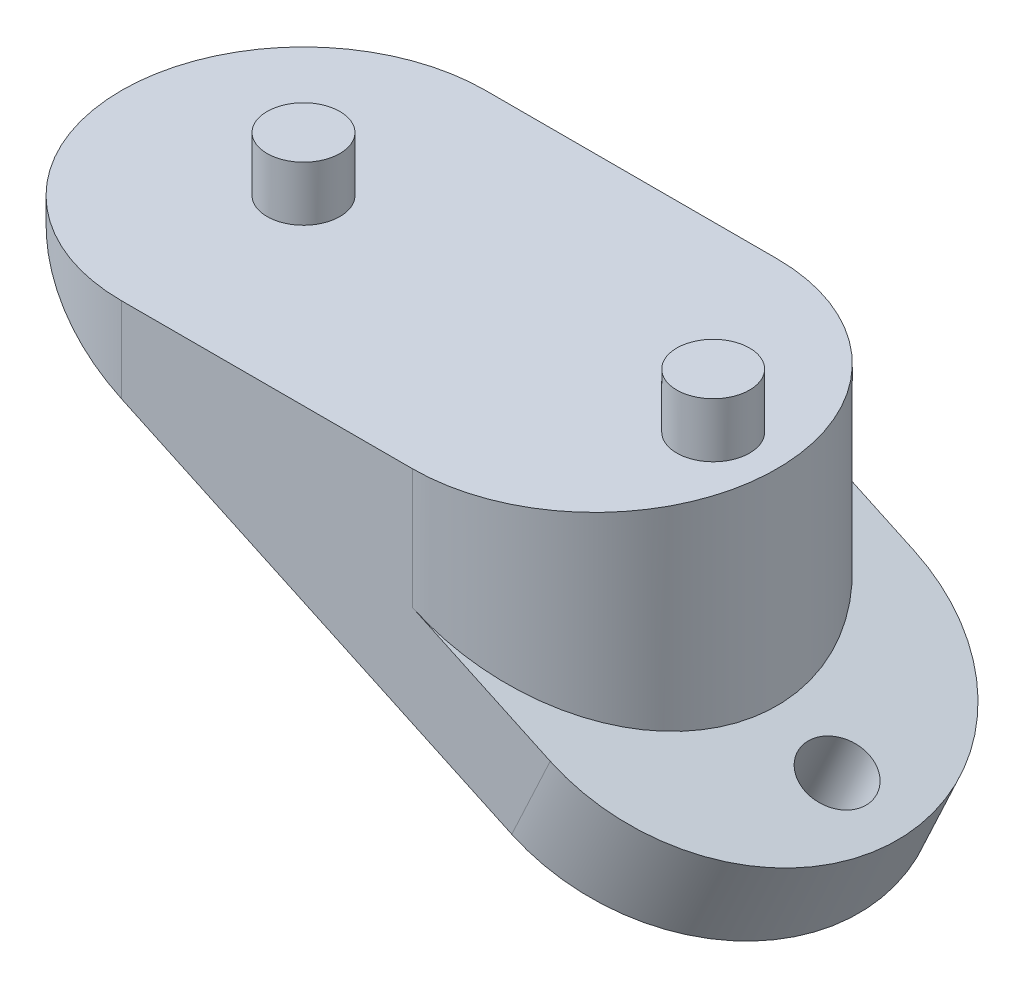
ISO-10303-21;
HEADER;
FILE_DESCRIPTION(('STEP AP214'),'2;1');
FILE_NAME('part.step','',(''),(''),'','','');
FILE_SCHEMA(('AUTOMOTIVE_DESIGN { 1 0 10303 214 1 1 1 1 }'));
ENDSEC;
DATA;
#1=APPLICATION_CONTEXT('core data for automotive mechanical design processes');
#2=APPLICATION_PROTOCOL_DEFINITION('international standard','automotive_design',2000,#1);
#3=PRODUCT_CONTEXT('',#1,'mechanical');
#4=PRODUCT('Part','Part','',(#3));
#5=PRODUCT_RELATED_PRODUCT_CATEGORY('part','',(#4));
#6=PRODUCT_DEFINITION_FORMATION('','',#4);
#7=PRODUCT_DEFINITION_CONTEXT('part definition',#1,'design');
#8=PRODUCT_DEFINITION('design','',#6,#7);
#9=PRODUCT_DEFINITION_SHAPE('','',#8);
#10=(LENGTH_UNIT() NAMED_UNIT(*) SI_UNIT(.MILLI.,.METRE.));
#11=(NAMED_UNIT(*) PLANE_ANGLE_UNIT() SI_UNIT($,.RADIAN.));
#12=(NAMED_UNIT(*) SI_UNIT($,.STERADIAN.) SOLID_ANGLE_UNIT());
#13=UNCERTAINTY_MEASURE_WITH_UNIT(LENGTH_MEASURE(1.E-05),#10,'distance_accuracy_value','');
#14=(GEOMETRIC_REPRESENTATION_CONTEXT(3) GLOBAL_UNCERTAINTY_ASSIGNED_CONTEXT((#13)) GLOBAL_UNIT_ASSIGNED_CONTEXT((#10,
#11,#12)) REPRESENTATION_CONTEXT('',''));
#15=CARTESIAN_POINT('',(0.,0.,0.));
#16=DIRECTION('',(0.,0.,1.));
#17=DIRECTION('',(1.,0.,0.));
#18=AXIS2_PLACEMENT_3D('',#15,#16,#17);
#19=CARTESIAN_POINT('',(-0.387635692740401,7.09992703370681,22.5504836688192));
#20=DIRECTION('',(0.422618261740697,0.906307787036651,0.));
#21=DIRECTION('',(-0.906307787036651,0.422618261740697,0.));
#22=AXIS2_PLACEMENT_3D('',#19,#20,#21);
#23=PLANE('',#22);
#24=CARTESIAN_POINT('',(37.956552029906,-10.7802613470959,12.5504836688192));
#25=DIRECTION('',(0.422618261740697,0.906307787036651,0.));
#26=DIRECTION('',(-0.906307787036651,0.422618261740697,0.));
#27=AXIS2_PLACEMENT_3D('',#24,#25,#26);
#28=CIRCLE('',#27,1.75);
#29=CARTESIAN_POINT('',(36.3705134025918,-10.0406793890497,12.5504836688192));
#30=VERTEX_POINT('',#29);
#31=EDGE_CURVE('E153',#30,#30,#28,.T.);
#32=ORIENTED_EDGE('',*,*,#31,.F.);
#33=EDGE_LOOP('',(#32));
#34=FACE_BOUND('',#33,.T.);
#35=DIRECTION('',(0.906307787036651,-0.422618261740697,0.));
#36=VECTOR('',#35,1.);
#37=CARTESIAN_POINT('',(-0.387635692740387,7.0999270337068,2.55048366881918));
#38=LINE('',#37,#36);
#39=CARTESIAN_POINT('',(24.649544079261,-4.57510163258079,2.55048366881919));
#40=VERTEX_POINT('',#39);
#41=CARTESIAN_POINT('',(32.2004821101844,-8.09616186265418,2.5504836688192));
#42=VERTEX_POINT('',#41);
#43=EDGE_CURVE('E65',#40,#42,#38,.T.);
#44=ORIENTED_EDGE('',*,*,#43,.F.);
#45=CARTESIAN_POINT('',(24.649544079261,-4.5751016325808,12.5504836688192));
#46=DIRECTION('',(0.422618261740697,0.906307787036651,0.));
#47=DIRECTION('',(-0.906307787036651,0.422618261740697,0.));
#48=AXIS2_PLACEMENT_3D('',#45,#46,#47);
#49=ELLIPSE('',#48,11.0337791896249,10.);
#50=CARTESIAN_POINT('',(24.649544079261,-4.5751016325808,22.5504836688192));
#51=VERTEX_POINT('',#50);
#52=EDGE_CURVE('E11',#51,#40,#49,.T.);
#53=ORIENTED_EDGE('',*,*,#52,.F.);
#54=DIRECTION('',(0.906307787036651,-0.422618261740697,0.));
#55=VECTOR('',#54,1.);
#56=CARTESIAN_POINT('',(-0.387635692740401,7.09992703370681,22.5504836688192));
#57=LINE('',#56,#55);
#58=CARTESIAN_POINT('',(32.2004821101844,-8.09616186265418,22.5504836688192));
#59=VERTEX_POINT('',#58);
#60=EDGE_CURVE('E53',#51,#59,#57,.T.);
#61=ORIENTED_EDGE('',*,*,#60,.T.);
#62=CARTESIAN_POINT('',(32.2004821101844,-8.09616186265418,12.5504836688192));
#63=DIRECTION('',(-0.422618261740697,-0.906307787036651,0.));
#64=DIRECTION('',(0.906307787036651,-0.422618261740697,0.));
#65=AXIS2_PLACEMENT_3D('',#62,#63,#64);
#66=CIRCLE('',#65,10.);
#67=EDGE_CURVE('E94',#59,#42,#66,.F.);
#68=ORIENTED_EDGE('',*,*,#67,.T.);
#69=EDGE_LOOP('',(#44,#53,#61,#68));
#70=FACE_BOUND('',#69,.T.);
#71=ADVANCED_FACE('F43',(#34,#70),#23,.T.);
#72=CARTESIAN_POINT('',(-0.387635692740401,7.09992703370681,22.5504836688192));
#73=DIRECTION('',(0.,0.,1.));
#74=DIRECTION('',(1.,0.,0.));
#75=AXIS2_PLACEMENT_3D('',#72,#73,#74);
#76=PLANE('',#75);
#77=ORIENTED_EDGE('',*,*,#60,.F.);
#78=DIRECTION('',(0.,1.,0.));
#79=VECTOR('',#78,1.);
#80=CARTESIAN_POINT('',(24.649544079261,-22.9679921153634,22.5504836688192));
#81=LINE('',#80,#79);
#82=CARTESIAN_POINT('',(24.649544079261,2.03200788463664,22.5504836688192));
#83=VERTEX_POINT('',#82);
#84=EDGE_CURVE('E121',#51,#83,#81,.T.);
#85=ORIENTED_EDGE('',*,*,#84,.T.);
#86=DIRECTION('',(-1.,0.,0.));
#87=VECTOR('',#86,1.);
#88=CARTESIAN_POINT('',(24.649544079261,2.03200788463664,22.5504836688192));
#89=LINE('',#88,#87);
#90=CARTESIAN_POINT('',(8.649544079261,2.03200788463664,22.5504836688192));
#91=VERTEX_POINT('',#90);
#92=EDGE_CURVE('E137',#83,#91,#89,.T.);
#93=ORIENTED_EDGE('',*,*,#92,.T.);
#94=DIRECTION('',(0.,1.,0.));
#95=VECTOR('',#94,1.);
#96=CARTESIAN_POINT('',(8.649544079261,-22.9679921153634,22.5504836688192));
#97=LINE('',#96,#95);
#98=CARTESIAN_POINT('',(8.649544079261,-2.63106869691332,22.5504836688192));
#99=VERTEX_POINT('',#98);
#100=EDGE_CURVE('E89',#99,#91,#97,.T.);
#101=ORIENTED_EDGE('',*,*,#100,.F.);
#102=DIRECTION('',(0.906307787036651,-0.422618261740697,0.));
#103=VECTOR('',#102,1.);
#104=CARTESIAN_POINT('',(0.537104380469853,1.15182406095361,22.5504836688192));
#105=LINE('',#104,#103);
#106=CARTESIAN_POINT('',(30.0873908014809,-12.6277007978374,22.5504836688192));
#107=VERTEX_POINT('',#106);
#108=EDGE_CURVE('E81',#99,#107,#105,.T.);
#109=ORIENTED_EDGE('',*,*,#108,.T.);
#110=DIRECTION('',(-0.422618261740697,-0.906307787036651,0.));
#111=VECTOR('',#110,1.);
#112=CARTESIAN_POINT('',(32.2004821101844,-8.09616186265418,22.5504836688192));
#113=LINE('',#112,#111);
#114=EDGE_CURVE('E84',#59,#107,#113,.T.);
#115=ORIENTED_EDGE('',*,*,#114,.F.);
#116=EDGE_LOOP('',(#77,#85,#93,#101,#109,#115));
#117=FACE_BOUND('',#116,.T.);
#118=ADVANCED_FACE('F83',(#117),#76,.T.);
#119=CARTESIAN_POINT('',(32.2004821101844,-8.09616186265418,12.5504836688192));
#120=DIRECTION('',(-0.422618261740697,-0.906307787036651,0.));
#121=DIRECTION('',(0.906307787036651,-0.422618261740697,0.));
#122=AXIS2_PLACEMENT_3D('',#119,#120,#121);
#123=CYLINDRICAL_SURFACE('',#122,10.);
#124=CARTESIAN_POINT('',(30.0873908014809,-12.6277007978374,12.5504836688192));
#125=DIRECTION('',(-0.422618261740697,-0.906307787036651,0.));
#126=DIRECTION('',(0.906307787036651,-0.422618261740697,0.));
#127=AXIS2_PLACEMENT_3D('',#124,#125,#126);
#128=CIRCLE('',#127,10.);
#129=CARTESIAN_POINT('',(30.0873908014809,-12.6277007978374,2.5504836688192));
#130=VERTEX_POINT('',#129);
#131=EDGE_CURVE('E95',#107,#130,#128,.F.);
#132=ORIENTED_EDGE('',*,*,#131,.T.);
#133=DIRECTION('',(-0.422618261740697,-0.906307787036651,0.));
#134=VECTOR('',#133,1.);
#135=CARTESIAN_POINT('',(32.2004821101844,-8.09616186265418,2.5504836688192));
#136=LINE('',#135,#134);
#137=EDGE_CURVE('E101',#42,#130,#136,.T.);
#138=ORIENTED_EDGE('',*,*,#137,.F.);
#139=ORIENTED_EDGE('',*,*,#67,.F.);
#140=ORIENTED_EDGE('',*,*,#114,.T.);
#141=EDGE_LOOP('',(#132,#138,#139,#140));
#142=FACE_BOUND('',#141,.T.);
#143=ADVANCED_FACE('F45',(#142),#123,.T.);
#144=CARTESIAN_POINT('',(-0.387635692740387,7.0999270337068,2.55048366881918));
#145=DIRECTION('',(0.,0.,1.));
#146=DIRECTION('',(1.,0.,0.));
#147=AXIS2_PLACEMENT_3D('',#144,#145,#146);
#148=PLANE('',#147);
#149=DIRECTION('',(0.906307787036651,-0.422618261740697,0.));
#150=VECTOR('',#149,1.);
#151=CARTESIAN_POINT('',(0.537104380469854,1.15182406095361,2.5504836688192));
#152=LINE('',#151,#150);
#153=CARTESIAN_POINT('',(8.649544079261,-2.63106869691331,2.5504836688192));
#154=VERTEX_POINT('',#153);
#155=EDGE_CURVE('E106',#154,#130,#152,.T.);
#156=ORIENTED_EDGE('',*,*,#155,.F.);
#157=DIRECTION('',(0.,1.,0.));
#158=VECTOR('',#157,1.);
#159=CARTESIAN_POINT('',(8.649544079261,-22.9679921153634,2.5504836688192));
#160=LINE('',#159,#158);
#161=CARTESIAN_POINT('',(8.649544079261,2.03200788463664,2.5504836688192));
#162=VERTEX_POINT('',#161);
#163=EDGE_CURVE('E120',#154,#162,#160,.T.);
#164=ORIENTED_EDGE('',*,*,#163,.T.);
#165=DIRECTION('',(1.,0.,0.));
#166=VECTOR('',#165,1.);
#167=CARTESIAN_POINT('',(8.649544079261,2.03200788463664,2.5504836688192));
#168=LINE('',#167,#166);
#169=CARTESIAN_POINT('',(24.649544079261,2.03200788463664,2.5504836688192));
#170=VERTEX_POINT('',#169);
#171=EDGE_CURVE('E119',#162,#170,#168,.T.);
#172=ORIENTED_EDGE('',*,*,#171,.T.);
#173=DIRECTION('',(0.,1.,0.));
#174=VECTOR('',#173,1.);
#175=CARTESIAN_POINT('',(24.649544079261,-22.9679921153634,2.5504836688192));
#176=LINE('',#175,#174);
#177=EDGE_CURVE('E115',#40,#170,#176,.T.);
#178=ORIENTED_EDGE('',*,*,#177,.F.);
#179=ORIENTED_EDGE('',*,*,#43,.T.);
#180=ORIENTED_EDGE('',*,*,#137,.T.);
#181=EDGE_LOOP('',(#156,#164,#172,#178,#179,#180));
#182=FACE_BOUND('',#181,.T.);
#183=ADVANCED_FACE('F180',(#182),#148,.F.);
#184=CARTESIAN_POINT('',(0.537104380469854,1.15182406095361,0.));
#185=DIRECTION('',(-0.422618261740697,-0.906307787036651,0.));
#186=DIRECTION('',(0.906307787036651,-0.422618261740697,0.));
#187=AXIS2_PLACEMENT_3D('',#184,#185,#186);
#188=PLANE('',#187);
#189=CARTESIAN_POINT('',(17.2930373513379,-6.66159580289394,12.5504836688192));
#190=DIRECTION('',(-0.422618261740697,-0.906307787036651,0.));
#191=DIRECTION('',(0.906307787036651,-0.422618261740697,0.));
#192=AXIS2_PLACEMENT_3D('',#189,#190,#191);
#193=CIRCLE('',#192,2.5);
#194=CARTESIAN_POINT('',(15.0272678837462,-5.6050501485422,12.5504836688192));
#195=VERTEX_POINT('',#194);
#196=EDGE_CURVE('E166',#195,#195,#193,.T.);
#197=ORIENTED_EDGE('',*,*,#196,.F.);
#198=EDGE_LOOP('',(#197));
#199=FACE_BOUND('',#198,.T.);
#200=CARTESIAN_POINT('',(23.6371918605944,-9.61992363507882,12.5504836688192));
#201=DIRECTION('',(-0.422618261740697,-0.906307787036651,0.));
#202=DIRECTION('',(0.906307787036651,-0.422618261740697,0.));
#203=AXIS2_PLACEMENT_3D('',#200,#201,#202);
#204=CIRCLE('',#203,2.5);
#205=CARTESIAN_POINT('',(21.3714223930028,-8.56337798072707,12.5504836688192));
#206=VERTEX_POINT('',#205);
#207=EDGE_CURVE('E160',#206,#206,#204,.T.);
#208=ORIENTED_EDGE('',*,*,#207,.F.);
#209=EDGE_LOOP('',(#208));
#210=FACE_BOUND('',#209,.T.);
#211=CARTESIAN_POINT('',(10.9488828420813,-3.70326797070906,12.5504836688192));
#212=DIRECTION('',(-0.422618261740697,-0.906307787036651,0.));
#213=DIRECTION('',(0.906307787036651,-0.422618261740697,0.));
#214=AXIS2_PLACEMENT_3D('',#211,#212,#213);
#215=CIRCLE('',#214,2.5);
#216=CARTESIAN_POINT('',(8.68311337448968,-2.64672231635732,12.5504836688192));
#217=VERTEX_POINT('',#216);
#218=EDGE_CURVE('E157',#217,#217,#215,.T.);
#219=ORIENTED_EDGE('',*,*,#218,.F.);
#220=EDGE_LOOP('',(#219));
#221=FACE_BOUND('',#220,.T.);
#222=CARTESIAN_POINT('',(35.8434607212025,-15.3118002822792,12.5504836688192));
#223=DIRECTION('',(-0.422618261740697,-0.906307787036651,0.));
#224=DIRECTION('',(0.906307787036651,-0.422618261740697,0.));
#225=AXIS2_PLACEMENT_3D('',#222,#223,#224);
#226=CIRCLE('',#225,1.75);
#227=CARTESIAN_POINT('',(37.4294993485166,-16.0513822403254,12.5504836688192));
#228=VERTEX_POINT('',#227);
#229=EDGE_CURVE('E47',#228,#228,#226,.T.);
#230=ORIENTED_EDGE('',*,*,#229,.F.);
#231=EDGE_LOOP('',(#230));
#232=FACE_BOUND('',#231,.T.);
#233=ORIENTED_EDGE('',*,*,#155,.T.);
#234=ORIENTED_EDGE('',*,*,#131,.F.);
#235=ORIENTED_EDGE('',*,*,#108,.F.);
#236=CARTESIAN_POINT('',(8.649544079261,-2.63106869691331,12.5504836688192));
#237=DIRECTION('',(-0.422618261740697,-0.906307787036651,0.));
#238=DIRECTION('',(-0.906307787036651,0.422618261740697,0.));
#239=AXIS2_PLACEMENT_3D('',#236,#237,#238);
#240=ELLIPSE('',#239,11.0337791896249,10.);
#241=CARTESIAN_POINT('',(-1.350455920739,2.03200788463664,12.5504836688192));
#242=VERTEX_POINT('',#241);
#243=EDGE_CURVE('E131',#99,#242,#240,.T.);
#244=ORIENTED_EDGE('',*,*,#243,.T.);
#245=EDGE_CURVE('E133',#242,#154,#240,.T.);
#246=ORIENTED_EDGE('',*,*,#245,.T.);
#247=EDGE_LOOP('',(#233,#234,#235,#244,#246));
#248=FACE_BOUND('',#247,.T.);
#249=ADVANCED_FACE('F103',(#199,#210,#221,#232,#248),#188,.T.);
#250=CARTESIAN_POINT('',(24.649544079261,-22.9679921153634,12.5504836688192));
#251=DIRECTION('',(0.,1.,0.));
#252=DIRECTION('',(0.,0.,1.));
#253=AXIS2_PLACEMENT_3D('',#250,#251,#252);
#254=CYLINDRICAL_SURFACE('',#253,10.);
#255=ORIENTED_EDGE('',*,*,#52,.T.);
#256=ORIENTED_EDGE('',*,*,#177,.T.);
#257=CARTESIAN_POINT('',(24.649544079261,2.03200788463664,12.5504836688192));
#258=DIRECTION('',(0.,-1.,0.));
#259=DIRECTION('',(0.,0.,-1.));
#260=AXIS2_PLACEMENT_3D('',#257,#258,#259);
#261=CIRCLE('',#260,10.);
#262=EDGE_CURVE('E134',#170,#83,#261,.T.);
#263=ORIENTED_EDGE('',*,*,#262,.T.);
#264=ORIENTED_EDGE('',*,*,#84,.F.);
#265=EDGE_LOOP('',(#255,#256,#263,#264));
#266=FACE_BOUND('',#265,.T.);
#267=ADVANCED_FACE('F179',(#266),#254,.T.);
#268=CARTESIAN_POINT('',(8.649544079261,5.03200788463664,12.5504836688192));
#269=DIRECTION('',(0.,1.,0.));
#270=DIRECTION('',(0.,0.,1.));
#271=AXIS2_PLACEMENT_3D('',#268,#269,#270);
#272=PLANE('',#271);
#273=CARTESIAN_POINT('',(8.649544079261,5.03200788463664,12.5504836688192));
#274=DIRECTION('',(0.,1.,0.));
#275=DIRECTION('',(0.,0.,1.));
#276=AXIS2_PLACEMENT_3D('',#273,#274,#275);
#277=CIRCLE('',#276,2.);
#278=CARTESIAN_POINT('',(8.649544079261,5.03200788463664,14.5504836688192));
#279=VERTEX_POINT('',#278);
#280=EDGE_CURVE('E128',#279,#279,#277,.T.);
#281=ORIENTED_EDGE('',*,*,#280,.T.);
#282=EDGE_LOOP('',(#281));
#283=FACE_BOUND('',#282,.T.);
#284=ADVANCED_FACE('F205',(#283),#272,.T.);
#285=CARTESIAN_POINT('',(31.149544079261,5.03200788463664,12.5504836688192));
#286=DIRECTION('',(0.,1.,0.));
#287=DIRECTION('',(0.,0.,1.));
#288=AXIS2_PLACEMENT_3D('',#285,#286,#287);
#289=PLANE('',#288);
#290=CARTESIAN_POINT('',(31.149544079261,5.03200788463664,12.5504836688192));
#291=DIRECTION('',(0.,1.,0.));
#292=DIRECTION('',(0.,0.,1.));
#293=AXIS2_PLACEMENT_3D('',#290,#291,#292);
#294=CIRCLE('',#293,2.);
#295=CARTESIAN_POINT('',(31.149544079261,5.03200788463664,14.5504836688192));
#296=VERTEX_POINT('',#295);
#297=EDGE_CURVE('E108',#296,#296,#294,.T.);
#298=ORIENTED_EDGE('',*,*,#297,.T.);
#299=EDGE_LOOP('',(#298));
#300=FACE_BOUND('',#299,.T.);
#301=ADVANCED_FACE('F212',(#300),#289,.T.);
#302=CARTESIAN_POINT('',(8.649544079261,5.03200788463664,12.5504836688192));
#303=DIRECTION('',(0.,-1.,0.));
#304=DIRECTION('',(0.,0.,-1.));
#305=AXIS2_PLACEMENT_3D('',#302,#303,#304);
#306=CYLINDRICAL_SURFACE('',#305,2.);
#307=ORIENTED_EDGE('',*,*,#280,.F.);
#308=EDGE_LOOP('',(#307));
#309=FACE_BOUND('',#308,.T.);
#310=CARTESIAN_POINT('',(8.649544079261,2.03200788463664,12.5504836688192));
#311=DIRECTION('',(0.,-1.,0.));
#312=DIRECTION('',(0.,0.,-1.));
#313=AXIS2_PLACEMENT_3D('',#310,#311,#312);
#314=CIRCLE('',#313,2.);
#315=CARTESIAN_POINT('',(8.649544079261,2.03200788463664,10.5504836688192));
#316=VERTEX_POINT('',#315);
#317=EDGE_CURVE('E125',#316,#316,#314,.F.);
#318=ORIENTED_EDGE('',*,*,#317,.T.);
#319=EDGE_LOOP('',(#318));
#320=FACE_BOUND('',#319,.T.);
#321=ADVANCED_FACE('F218',(#309,#320),#306,.T.);
#322=CARTESIAN_POINT('',(31.149544079261,5.03200788463664,12.5504836688192));
#323=DIRECTION('',(0.,-1.,0.));
#324=DIRECTION('',(0.,0.,-1.));
#325=AXIS2_PLACEMENT_3D('',#322,#323,#324);
#326=CYLINDRICAL_SURFACE('',#325,2.);
#327=ORIENTED_EDGE('',*,*,#297,.F.);
#328=EDGE_LOOP('',(#327));
#329=FACE_BOUND('',#328,.T.);
#330=CARTESIAN_POINT('',(31.149544079261,2.03200788463664,12.5504836688192));
#331=DIRECTION('',(0.,-1.,0.));
#332=DIRECTION('',(0.,0.,-1.));
#333=AXIS2_PLACEMENT_3D('',#330,#331,#332);
#334=CIRCLE('',#333,2.);
#335=CARTESIAN_POINT('',(31.149544079261,2.03200788463664,10.5504836688192));
#336=VERTEX_POINT('',#335);
#337=EDGE_CURVE('E150',#336,#336,#334,.F.);
#338=ORIENTED_EDGE('',*,*,#337,.T.);
#339=EDGE_LOOP('',(#338));
#340=FACE_BOUND('',#339,.T.);
#341=ADVANCED_FACE('F225',(#329,#340),#326,.T.);
#342=CARTESIAN_POINT('',(24.649544079261,2.03200788463664,12.5504836688192));
#343=DIRECTION('',(0.,-1.,0.));
#344=DIRECTION('',(0.,0.,-1.));
#345=AXIS2_PLACEMENT_3D('',#342,#343,#344);
#346=PLANE('',#345);
#347=ORIENTED_EDGE('',*,*,#337,.F.);
#348=EDGE_LOOP('',(#347));
#349=FACE_BOUND('',#348,.T.);
#350=ORIENTED_EDGE('',*,*,#317,.F.);
#351=EDGE_LOOP('',(#350));
#352=FACE_BOUND('',#351,.T.);
#353=ORIENTED_EDGE('',*,*,#262,.F.);
#354=ORIENTED_EDGE('',*,*,#171,.F.);
#355=CARTESIAN_POINT('',(8.649544079261,2.03200788463664,12.5504836688192));
#356=DIRECTION('',(0.,-1.,0.));
#357=DIRECTION('',(0.,0.,-1.));
#358=AXIS2_PLACEMENT_3D('',#355,#356,#357);
#359=CIRCLE('',#358,10.);
#360=EDGE_CURVE('E139',#242,#162,#359,.T.);
#361=ORIENTED_EDGE('',*,*,#360,.F.);
#362=EDGE_CURVE('E140',#91,#242,#359,.T.);
#363=ORIENTED_EDGE('',*,*,#362,.F.);
#364=ORIENTED_EDGE('',*,*,#92,.F.);
#365=EDGE_LOOP('',(#353,#354,#361,#363,#364));
#366=FACE_BOUND('',#365,.T.);
#367=ADVANCED_FACE('F227',(#349,#352,#366),#346,.F.);
#368=CARTESIAN_POINT('',(8.649544079261,-22.9679921153634,12.5504836688192));
#369=DIRECTION('',(0.,1.,0.));
#370=DIRECTION('',(0.,0.,1.));
#371=AXIS2_PLACEMENT_3D('',#368,#369,#370);
#372=CYLINDRICAL_SURFACE('',#371,10.);
#373=ORIENTED_EDGE('',*,*,#245,.F.);
#374=ORIENTED_EDGE('',*,*,#360,.T.);
#375=ORIENTED_EDGE('',*,*,#163,.F.);
#376=EDGE_LOOP('',(#373,#374,#375));
#377=FACE_BOUND('',#376,.T.);
#378=ADVANCED_FACE('F233',(#377),#372,.T.);
#379=ORIENTED_EDGE('',*,*,#243,.F.);
#380=ORIENTED_EDGE('',*,*,#100,.T.);
#381=ORIENTED_EDGE('',*,*,#362,.T.);
#382=EDGE_LOOP('',(#379,#380,#381));
#383=FACE_BOUND('',#382,.T.);
#384=ADVANCED_FACE('F192',(#383),#372,.T.);
#385=CARTESIAN_POINT('',(28.609744679391,-30.8245543949449,12.5504836688192));
#386=DIRECTION('',(0.422618261740697,0.906307787036651,0.));
#387=DIRECTION('',(-0.906307787036651,0.422618261740697,0.));
#388=AXIS2_PLACEMENT_3D('',#385,#386,#387);
#389=CYLINDRICAL_SURFACE('',#388,1.75);
#390=ORIENTED_EDGE('',*,*,#229,.T.);
#391=EDGE_LOOP('',(#390));
#392=FACE_BOUND('',#391,.T.);
#393=ORIENTED_EDGE('',*,*,#31,.T.);
#394=EDGE_LOOP('',(#393));
#395=FACE_BOUND('',#394,.T.);
#396=ADVANCED_FACE('F188',(#392,#395),#389,.F.);
#397=CARTESIAN_POINT('',(9.68102805685922,-6.42219133181902,12.5504836688192));
#398=DIRECTION('',(0.422618261740697,0.906307787036651,0.));
#399=DIRECTION('',(-0.906307787036651,0.422618261740697,0.));
#400=AXIS2_PLACEMENT_3D('',#397,#398,#399);
#401=CYLINDRICAL_SURFACE('',#400,2.5);
#402=CARTESIAN_POINT('',(9.68102805685922,-6.42219133181902,12.5504836688192));
#403=DIRECTION('',(-0.422618261740697,-0.906307787036651,0.));
#404=DIRECTION('',(0.906307787036651,-0.422618261740697,0.));
#405=AXIS2_PLACEMENT_3D('',#402,#403,#404);
#406=CIRCLE('',#405,2.5);
#407=CARTESIAN_POINT('',(7.41525858926759,-5.36564567746727,12.5504836688192));
#408=VERTEX_POINT('',#407);
#409=EDGE_CURVE('E156',#408,#408,#406,.T.);
#410=CARTESIAN_POINT('',(7.41525858926759,-5.36564567746727,12.5504836688192));
#411=CARTESIAN_POINT('',(7.42846540994698,-5.33732355912238,12.5504836688192));
#412=CARTESIAN_POINT('',(7.44167223062638,-5.30900144077748,12.5504836688192));
#413=CARTESIAN_POINT('',(7.46808587198517,-5.25235720408769,12.5504836688192));
#414=CARTESIAN_POINT('',(7.48129269266457,-5.2240350857428,12.5504836688192));
#415=CARTESIAN_POINT('',(7.50770633402336,-5.16739084905301,12.5504836688192));
#416=CARTESIAN_POINT('',(7.52091315470276,-5.13906873070811,12.5504836688192));
#417=CARTESIAN_POINT('',(7.54732679606155,-5.08242449401832,12.5504836688192));
#418=CARTESIAN_POINT('',(7.56053361674095,-5.05410237567342,12.5504836688192));
#419=CARTESIAN_POINT('',(7.58694725809974,-4.99745813898363,12.5504836688192));
#420=CARTESIAN_POINT('',(7.60015407877914,-4.96913602063874,12.5504836688192));
#421=CARTESIAN_POINT('',(7.62656772013793,-4.91249178394895,12.5504836688192));
#422=CARTESIAN_POINT('',(7.63977454081733,-4.88416966560405,12.5504836688192));
#423=CARTESIAN_POINT('',(7.66618818217612,-4.82752542891426,12.5504836688192));
#424=CARTESIAN_POINT('',(7.67939500285552,-4.79920331056937,12.5504836688192));
#425=CARTESIAN_POINT('',(7.70580864421431,-4.74255907387958,12.5504836688192));
#426=CARTESIAN_POINT('',(7.71901546489371,-4.71423695553468,12.5504836688192));
#427=CARTESIAN_POINT('',(7.74542910625251,-4.65759271884489,12.5504836688192));
#428=CARTESIAN_POINT('',(7.7586359269319,-4.62927060049999,12.5504836688192));
#429=CARTESIAN_POINT('',(7.7850495682907,-4.5726263638102,12.5504836688192));
#430=CARTESIAN_POINT('',(7.79825638897009,-4.54430424546531,12.5504836688192));
#431=CARTESIAN_POINT('',(7.82467003032889,-4.48766000877552,12.5504836688192));
#432=CARTESIAN_POINT('',(7.83787685100828,-4.45933789043062,12.5504836688192));
#433=CARTESIAN_POINT('',(7.86429049236708,-4.40269365374083,12.5504836688192));
#434=CARTESIAN_POINT('',(7.87749731304647,-4.37437153539594,12.5504836688192));
#435=CARTESIAN_POINT('',(7.90391095440527,-4.31772729870615,12.5504836688192));
#436=CARTESIAN_POINT('',(7.91711777508466,-4.28940518036125,12.5504836688192));
#437=CARTESIAN_POINT('',(7.94353141644346,-4.23276094367146,12.5504836688192));
#438=CARTESIAN_POINT('',(7.95673823712285,-4.20443882532656,12.5504836688192));
#439=CARTESIAN_POINT('',(7.98315187848165,-4.14779458863677,12.5504836688192));
#440=CARTESIAN_POINT('',(7.99635869916104,-4.11947247029188,12.5504836688192));
#441=CARTESIAN_POINT('',(8.02277234051984,-4.06282823360209,12.5504836688192));
#442=CARTESIAN_POINT('',(8.03597916119923,-4.03450611525719,12.5504836688192));
#443=CARTESIAN_POINT('',(8.06239280255803,-3.9778618785674,12.5504836688192));
#444=CARTESIAN_POINT('',(8.07559962323742,-3.94953976022251,12.5504836688192));
#445=CARTESIAN_POINT('',(8.10201326459622,-3.89289552353272,12.5504836688192));
#446=CARTESIAN_POINT('',(8.11522008527562,-3.86457340518782,12.5504836688192));
#447=CARTESIAN_POINT('',(8.14163372663441,-3.80792916849803,12.5504836688192));
#448=CARTESIAN_POINT('',(8.15484054731381,-3.77960705015313,12.5504836688192));
#449=CARTESIAN_POINT('',(8.1812541886726,-3.72296281346334,12.5504836688192));
#450=CARTESIAN_POINT('',(8.194461009352,-3.69464069511845,12.5504836688192));
#451=CARTESIAN_POINT('',(8.22087465071079,-3.63799645842866,12.5504836688192));
#452=CARTESIAN_POINT('',(8.23408147139019,-3.60967434008376,12.5504836688192));
#453=CARTESIAN_POINT('',(8.26049511274898,-3.55303010339397,12.5504836688192));
#454=CARTESIAN_POINT('',(8.27370193342838,-3.52470798504908,12.5504836688192));
#455=CARTESIAN_POINT('',(8.30011557478717,-3.46806374835929,12.5504836688192));
#456=CARTESIAN_POINT('',(8.31332239546657,-3.43974163001439,12.5504836688192));
#457=CARTESIAN_POINT('',(8.33973603682536,-3.3830973933246,12.5504836688192));
#458=CARTESIAN_POINT('',(8.35294285750476,-3.3547752749797,12.5504836688192));
#459=CARTESIAN_POINT('',(8.37935649886355,-3.29813103828991,12.5504836688192));
#460=CARTESIAN_POINT('',(8.39256331954295,-3.26980891994502,12.5504836688192));
#461=CARTESIAN_POINT('',(8.41897696090174,-3.21316468325523,12.5504836688192));
#462=CARTESIAN_POINT('',(8.43218378158114,-3.18484256491033,12.5504836688192));
#463=CARTESIAN_POINT('',(8.45859742293993,-3.12819832822054,12.5504836688192));
#464=CARTESIAN_POINT('',(8.47180424361933,-3.09987620987565,12.5504836688192));
#465=CARTESIAN_POINT('',(8.49821788497812,-3.04323197318585,12.5504836688192));
#466=CARTESIAN_POINT('',(8.51142470565752,-3.01490985484096,12.5504836688192));
#467=CARTESIAN_POINT('',(8.53783834701631,-2.95826561815117,12.5504836688192));
#468=CARTESIAN_POINT('',(8.55104516769571,-2.92994349980627,12.5504836688192));
#469=CARTESIAN_POINT('',(8.5774588090545,-2.87329926311648,12.5504836688192));
#470=CARTESIAN_POINT('',(8.5906656297339,-2.84497714477159,12.5504836688192));
#471=CARTESIAN_POINT('',(8.61707927109269,-2.7883329080818,12.5504836688192));
#472=CARTESIAN_POINT('',(8.63028609177209,-2.7600107897369,12.5504836688192));
#473=CARTESIAN_POINT('',(8.65669973313088,-2.70336655304711,12.5504836688192));
#474=CARTESIAN_POINT('',(8.66990655381028,-2.67504443470222,12.5504836688192));
#475=CARTESIAN_POINT('',(8.68311337448968,-2.64672231635732,12.5504836688192));
#476=B_SPLINE_CURVE_WITH_KNOTS('',3,(#410,#411,#412,#413,#414,#415,#416,#417,#418,#419,#420,
#421,#422,#423,#424,#425,#426,#427,#428,#429,#430,#431,#432,#433,#434,#435,#436,#437,#438,#439,
#440,#441,#442,#443,#444,#445,#446,#447,#448,#449,#450,#451,#452,#453,#454,#455,#456,#457,#458,
#459,#460,#461,#462,#463,#464,#465,#466,#467,#468,#469,#470,#471,#472,#473,#474,#475),
.UNSPECIFIED.,.F.,.F.,(4,2,2,2,2,2,2,2,2,2,2,2,2,2,2,2,2,2,2,2,2,2,2,2,2,2,2,2,2,2,2,2,4),(0.,
0.0937500000000002,0.1875,0.28125,0.375000000000001,0.46875,0.5625,0.65625,0.750000000000001,
0.84375,0.9375,1.03125,1.125,1.21875,1.3125,1.40625,1.5,1.59375,1.6875,1.78125,1.875,1.96875,
2.0625,2.15625,2.25,2.34375,2.4375,2.53125,2.625,2.71875,2.8125,2.90625,3.),.UNSPECIFIED.);
#477=EDGE_CURVE('BSEAM191',#408,#217,#476,.T.);
#478=ORIENTED_EDGE('',*,*,#409,.F.);
#479=ORIENTED_EDGE('',*,*,#218,.T.);
#480=ORIENTED_EDGE('',*,*,#477,.T.);
#481=ORIENTED_EDGE('',*,*,#477,.F.);
#482=EDGE_LOOP('',(#478,#480,#479,#481));
#483=FACE_BOUND('',#482,.T.);
#484=ADVANCED_FACE('F191',(#483),#401,.T.);
#485=CARTESIAN_POINT('',(-0.730750404752238,-1.56709930015635,0.));
#486=DIRECTION('',(-0.422618261740697,-0.906307787036651,0.));
#487=DIRECTION('',(0.906307787036651,-0.422618261740697,0.));
#488=AXIS2_PLACEMENT_3D('',#485,#486,#487);
#489=PLANE('',#488);
#490=ORIENTED_EDGE('',*,*,#409,.T.);
#491=EDGE_LOOP('',(#490));
#492=FACE_BOUND('',#491,.T.);
#493=ADVANCED_FACE('F271',(#492),#489,.T.);
#494=CARTESIAN_POINT('',(22.3693370753723,-12.3388469961888,12.5504836688192));
#495=DIRECTION('',(0.422618261740697,0.906307787036651,0.));
#496=DIRECTION('',(-0.906307787036651,0.422618261740697,0.));
#497=AXIS2_PLACEMENT_3D('',#494,#495,#496);
#498=CYLINDRICAL_SURFACE('',#497,2.5);
#499=CARTESIAN_POINT('',(22.3693370753723,-12.3388469961888,12.5504836688192));
#500=DIRECTION('',(-0.422618261740697,-0.906307787036651,0.));
#501=DIRECTION('',(0.906307787036651,-0.422618261740697,0.));
#502=AXIS2_PLACEMENT_3D('',#499,#500,#501);
#503=CIRCLE('',#502,2.5);
#504=CARTESIAN_POINT('',(20.1035676077807,-11.282301341837,12.5504836688192));
#505=VERTEX_POINT('',#504);
#506=EDGE_CURVE('E163',#505,#505,#503,.T.);
#507=CARTESIAN_POINT('',(20.1035676077807,-11.282301341837,12.5504836688192));
#508=CARTESIAN_POINT('',(20.1167744284601,-11.2539792234921,12.5504836688192));
#509=CARTESIAN_POINT('',(20.1299812491395,-11.2256571051472,12.5504836688192));
#510=CARTESIAN_POINT('',(20.1563948904983,-11.1690128684574,12.5504836688192));
#511=CARTESIAN_POINT('',(20.1696017111777,-11.1406907501126,12.5504836688192));
#512=CARTESIAN_POINT('',(20.1960153525365,-11.0840465134228,12.5504836688192));
#513=CARTESIAN_POINT('',(20.2092221732159,-11.0557243950779,12.5504836688192));
#514=CARTESIAN_POINT('',(20.2356358145747,-10.9990801583881,12.5504836688192));
#515=CARTESIAN_POINT('',(20.2488426352541,-10.9707580400432,12.5504836688192));
#516=CARTESIAN_POINT('',(20.2752562766129,-10.9141138033534,12.5504836688192));
#517=CARTESIAN_POINT('',(20.2884630972923,-10.8857916850085,12.5504836688192));
#518=CARTESIAN_POINT('',(20.3148767386511,-10.8291474483187,12.5504836688192));
#519=CARTESIAN_POINT('',(20.3280835593304,-10.8008253299738,12.5504836688192));
#520=CARTESIAN_POINT('',(20.3544972006892,-10.744181093284,12.5504836688192));
#521=CARTESIAN_POINT('',(20.3677040213686,-10.7158589749391,12.5504836688192));
#522=CARTESIAN_POINT('',(20.3941176627274,-10.6592147382493,12.5504836688192));
#523=CARTESIAN_POINT('',(20.4073244834068,-10.6308926199044,12.5504836688192));
#524=CARTESIAN_POINT('',(20.4337381247656,-10.5742483832146,12.5504836688192));
#525=CARTESIAN_POINT('',(20.446944945445,-10.5459262648697,12.5504836688192));
#526=CARTESIAN_POINT('',(20.4733585868038,-10.48928202818,12.5504836688192));
#527=CARTESIAN_POINT('',(20.4865654074832,-10.4609599098351,12.5504836688192));
#528=CARTESIAN_POINT('',(20.512979048842,-10.4043156731453,12.5504836688192));
#529=CARTESIAN_POINT('',(20.5261858695214,-10.3759935548004,12.5504836688192));
#530=CARTESIAN_POINT('',(20.5525995108802,-10.3193493181106,12.5504836688192));
#531=CARTESIAN_POINT('',(20.5658063315596,-10.2910271997657,12.5504836688192));
#532=CARTESIAN_POINT('',(20.5922199729184,-10.2343829630759,12.5504836688192));
#533=CARTESIAN_POINT('',(20.6054267935978,-10.206060844731,12.5504836688192));
#534=CARTESIAN_POINT('',(20.6318404349566,-10.1494166080412,12.5504836688192));
#535=CARTESIAN_POINT('',(20.645047255636,-10.1210944896963,12.5504836688192));
#536=CARTESIAN_POINT('',(20.6714608969948,-10.0644502530065,12.5504836688192));
#537=CARTESIAN_POINT('',(20.6846677176742,-10.0361281346616,12.5504836688192));
#538=CARTESIAN_POINT('',(20.711081359033,-9.97948389797184,12.5504836688192));
#539=CARTESIAN_POINT('',(20.7242881797124,-9.95116177962695,12.5504836688192));
#540=CARTESIAN_POINT('',(20.7507018210712,-9.89451754293715,12.5504836688192));
#541=CARTESIAN_POINT('',(20.7639086417505,-9.86619542459226,12.5504836688192));
#542=CARTESIAN_POINT('',(20.7903222831093,-9.80955118790247,12.5504836688192));
#543=CARTESIAN_POINT('',(20.8035291037887,-9.78122906955757,12.5504836688192));
#544=CARTESIAN_POINT('',(20.8299427451475,-9.72458483286778,12.5504836688192));
#545=CARTESIAN_POINT('',(20.8431495658269,-9.69626271452289,12.5504836688192));
#546=CARTESIAN_POINT('',(20.8695632071857,-9.6396184778331,12.5504836688192));
#547=CARTESIAN_POINT('',(20.8827700278651,-9.6112963594882,12.5504836688192));
#548=CARTESIAN_POINT('',(20.9091836692239,-9.55465212279841,12.5504836688192));
#549=CARTESIAN_POINT('',(20.9223904899033,-9.52633000445351,12.5504836688192));
#550=CARTESIAN_POINT('',(20.9488041312621,-9.46968576776372,12.5504836688192));
#551=CARTESIAN_POINT('',(20.9620109519415,-9.44136364941883,12.5504836688192));
#552=CARTESIAN_POINT('',(20.9884245933003,-9.38471941272904,12.5504836688192));
#553=CARTESIAN_POINT('',(21.0016314139797,-9.35639729438414,12.5504836688192));
#554=CARTESIAN_POINT('',(21.0280450553385,-9.29975305769435,12.5504836688192));
#555=CARTESIAN_POINT('',(21.0412518760179,-9.27143093934946,12.5504836688192));
#556=CARTESIAN_POINT('',(21.0676655173767,-9.21478670265967,12.5504836688192));
#557=CARTESIAN_POINT('',(21.0808723380561,-9.18646458431477,12.5504836688192));
#558=CARTESIAN_POINT('',(21.1072859794149,-9.12982034762498,12.5504836688192));
#559=CARTESIAN_POINT('',(21.1204928000943,-9.10149822928009,12.5504836688192));
#560=CARTESIAN_POINT('',(21.1469064414531,-9.04485399259029,12.5504836688192));
#561=CARTESIAN_POINT('',(21.1601132621324,-9.0165318742454,12.5504836688192));
#562=CARTESIAN_POINT('',(21.1865269034912,-8.95988763755561,12.5504836688192));
#563=CARTESIAN_POINT('',(21.1997337241706,-8.93156551921071,12.5504836688192));
#564=CARTESIAN_POINT('',(21.2261473655294,-8.87492128252092,12.5504836688192));
#565=CARTESIAN_POINT('',(21.2393541862088,-8.84659916417603,12.5504836688192));
#566=CARTESIAN_POINT('',(21.2657678275676,-8.78995492748624,12.5504836688192));
#567=CARTESIAN_POINT('',(21.278974648247,-8.76163280914134,12.5504836688192));
#568=CARTESIAN_POINT('',(21.3053882896058,-8.70498857245155,12.5504836688192));
#569=CARTESIAN_POINT('',(21.3185951102852,-8.67666645410666,12.5504836688192));
#570=CARTESIAN_POINT('',(21.345008751644,-8.62002221741687,12.5504836688192));
#571=CARTESIAN_POINT('',(21.3582155723234,-8.59170009907197,12.5504836688192));
#572=CARTESIAN_POINT('',(21.3714223930028,-8.56337798072707,12.5504836688192));
#573=B_SPLINE_CURVE_WITH_KNOTS('',3,(#507,#508,#509,#510,#511,#512,#513,#514,#515,#516,#517,
#518,#519,#520,#521,#522,#523,#524,#525,#526,#527,#528,#529,#530,#531,#532,#533,#534,#535,#536,
#537,#538,#539,#540,#541,#542,#543,#544,#545,#546,#547,#548,#549,#550,#551,#552,#553,#554,#555,
#556,#557,#558,#559,#560,#561,#562,#563,#564,#565,#566,#567,#568,#569,#570,#571,#572),
.UNSPECIFIED.,.F.,.F.,(4,2,2,2,2,2,2,2,2,2,2,2,2,2,2,2,2,2,2,2,2,2,2,2,2,2,2,2,2,2,2,2,4),(0.,
0.0937499999999998,0.187500000000001,0.281250000000001,0.375000000000001,0.468750000000001,
0.562500000000001,0.656250000000002,0.75,0.84375,0.9375,1.03125,1.125,1.21875,1.3125,1.40625,
1.5,1.59375,1.6875,1.78125,1.875,1.96875,2.0625,2.15625,2.25,2.34375,2.4375,2.53125,2.625,
2.71875,2.8125,2.90625,3.),.UNSPECIFIED.);
#574=EDGE_CURVE('BSEAM275',#505,#206,#573,.T.);
#575=ORIENTED_EDGE('',*,*,#506,.F.);
#576=ORIENTED_EDGE('',*,*,#207,.T.);
#577=ORIENTED_EDGE('',*,*,#574,.T.);
#578=ORIENTED_EDGE('',*,*,#574,.F.);
#579=EDGE_LOOP('',(#575,#577,#576,#578));
#580=FACE_BOUND('',#579,.T.);
#581=ADVANCED_FACE('F275',(#580),#498,.T.);
#582=CARTESIAN_POINT('',(22.3693370753723,-12.3388469961888,12.5504836688192));
#583=DIRECTION('',(-0.422618261740697,-0.906307787036651,0.));
#584=DIRECTION('',(0.906307787036651,-0.422618261740697,0.));
#585=AXIS2_PLACEMENT_3D('',#582,#583,#584);
#586=PLANE('',#585);
#587=ORIENTED_EDGE('',*,*,#506,.T.);
#588=EDGE_LOOP('',(#587));
#589=FACE_BOUND('',#588,.T.);
#590=ADVANCED_FACE('F277',(#589),#586,.T.);
#591=CARTESIAN_POINT('',(16.0251825661158,-9.38051916400389,12.5504836688192));
#592=DIRECTION('',(0.422618261740697,0.906307787036651,0.));
#593=DIRECTION('',(-0.906307787036651,0.422618261740697,0.));
#594=AXIS2_PLACEMENT_3D('',#591,#592,#593);
#595=CYLINDRICAL_SURFACE('',#594,2.5);
#596=CARTESIAN_POINT('',(16.0251825661158,-9.38051916400389,12.5504836688192));
#597=DIRECTION('',(-0.422618261740697,-0.906307787036651,0.));
#598=DIRECTION('',(0.906307787036651,-0.422618261740697,0.));
#599=AXIS2_PLACEMENT_3D('',#596,#597,#598);
#600=CIRCLE('',#599,2.5);
#601=CARTESIAN_POINT('',(13.7594130985241,-8.32397350965215,12.5504836688192));
#602=VERTEX_POINT('',#601);
#603=EDGE_CURVE('E169',#602,#602,#600,.T.);
#604=CARTESIAN_POINT('',(13.7594130985241,-8.32397350965215,12.5504836688192));
#605=CARTESIAN_POINT('',(13.7726199192035,-8.29565139130725,12.5504836688192));
#606=CARTESIAN_POINT('',(13.7858267398829,-8.26732927296236,12.5504836688192));
#607=CARTESIAN_POINT('',(13.8122403812417,-8.21068503627257,12.5504836688192));
#608=CARTESIAN_POINT('',(13.8254472019211,-8.18236291792767,12.5504836688192));
#609=CARTESIAN_POINT('',(13.8518608432799,-8.12571868123788,12.5504836688192));
#610=CARTESIAN_POINT('',(13.8650676639593,-8.09739656289299,12.5504836688192));
#611=CARTESIAN_POINT('',(13.8914813053181,-8.0407523262032,12.5504836688192));
#612=CARTESIAN_POINT('',(13.9046881259975,-8.0124302078583,12.5504836688192));
#613=CARTESIAN_POINT('',(13.9311017673563,-7.95578597116851,12.5504836688192));
#614=CARTESIAN_POINT('',(13.9443085880357,-7.92746385282361,12.5504836688192));
#615=CARTESIAN_POINT('',(13.9707222293945,-7.87081961613382,12.5504836688192));
#616=CARTESIAN_POINT('',(13.9839290500739,-7.84249749778893,12.5504836688192));
#617=CARTESIAN_POINT('',(14.0103426914327,-7.78585326109914,12.5504836688192));
#618=CARTESIAN_POINT('',(14.0235495121121,-7.75753114275424,12.5504836688192));
#619=CARTESIAN_POINT('',(14.0499631534709,-7.70088690606445,12.5504836688192));
#620=CARTESIAN_POINT('',(14.0631699741503,-7.67256478771955,12.5504836688192));
#621=CARTESIAN_POINT('',(14.0895836155091,-7.61592055102976,12.5504836688192));
#622=CARTESIAN_POINT('',(14.1027904361885,-7.58759843268487,12.5504836688192));
#623=CARTESIAN_POINT('',(14.1292040775473,-7.53095419599508,12.5504836688192));
#624=CARTESIAN_POINT('',(14.1424108982267,-7.50263207765018,12.5504836688192));
#625=CARTESIAN_POINT('',(14.1688245395854,-7.44598784096039,12.5504836688192));
#626=CARTESIAN_POINT('',(14.1820313602648,-7.4176657226155,12.5504836688192));
#627=CARTESIAN_POINT('',(14.2084450016236,-7.36102148592571,12.5504836688192));
#628=CARTESIAN_POINT('',(14.221651822303,-7.33269936758081,12.5504836688192));
#629=CARTESIAN_POINT('',(14.2480654636618,-7.27605513089102,12.5504836688192));
#630=CARTESIAN_POINT('',(14.2612722843412,-7.24773301254613,12.5504836688192));
#631=CARTESIAN_POINT('',(14.2876859257,-7.19108877585633,12.5504836688192));
#632=CARTESIAN_POINT('',(14.3008927463794,-7.16276665751144,12.5504836688192));
#633=CARTESIAN_POINT('',(14.3273063877382,-7.10612242082165,12.5504836688192));
#634=CARTESIAN_POINT('',(14.3405132084176,-7.07780030247675,12.5504836688192));
#635=CARTESIAN_POINT('',(14.3669268497764,-7.02115606578696,12.5504836688192));
#636=CARTESIAN_POINT('',(14.3801336704558,-6.99283394744207,12.5504836688192));
#637=CARTESIAN_POINT('',(14.4065473118146,-6.93618971075228,12.5504836688192));
#638=CARTESIAN_POINT('',(14.419754132494,-6.90786759240738,12.5504836688192));
#639=CARTESIAN_POINT('',(14.4461677738528,-6.85122335571759,12.5504836688192));
#640=CARTESIAN_POINT('',(14.4593745945322,-6.8229012373727,12.5504836688192));
#641=CARTESIAN_POINT('',(14.485788235891,-6.7662570006829,12.5504836688192));
#642=CARTESIAN_POINT('',(14.4989950565704,-6.73793488233801,12.5504836688192));
#643=CARTESIAN_POINT('',(14.5254086979292,-6.68129064564822,12.5504836688192));
#644=CARTESIAN_POINT('',(14.5386155186086,-6.65296852730332,12.5504836688192));
#645=CARTESIAN_POINT('',(14.5650291599674,-6.59632429061353,12.5504836688192));
#646=CARTESIAN_POINT('',(14.5782359806467,-6.56800217226864,12.5504836688192));
#647=CARTESIAN_POINT('',(14.6046496220055,-6.51135793557885,12.5504836688192));
#648=CARTESIAN_POINT('',(14.6178564426849,-6.48303581723395,12.5504836688192));
#649=CARTESIAN_POINT('',(14.6442700840437,-6.42639158054416,12.5504836688192));
#650=CARTESIAN_POINT('',(14.6574769047231,-6.39806946219926,12.5504836688192));
#651=CARTESIAN_POINT('',(14.6838905460819,-6.34142522550947,12.5504836688192));
#652=CARTESIAN_POINT('',(14.6970973667613,-6.31310310716458,12.5504836688192));
#653=CARTESIAN_POINT('',(14.7235110081201,-6.25645887047479,12.5504836688192));
#654=CARTESIAN_POINT('',(14.7367178287995,-6.22813675212989,12.5504836688192));
#655=CARTESIAN_POINT('',(14.7631314701583,-6.1714925154401,12.5504836688192));
#656=CARTESIAN_POINT('',(14.7763382908377,-6.14317039709521,12.5504836688192));
#657=CARTESIAN_POINT('',(14.8027519321965,-6.08652616040542,12.5504836688192));
#658=CARTESIAN_POINT('',(14.8159587528759,-6.05820404206052,12.5504836688192));
#659=CARTESIAN_POINT('',(14.8423723942347,-6.00155980537073,12.5504836688192));
#660=CARTESIAN_POINT('',(14.8555792149141,-5.97323768702583,12.5504836688192));
#661=CARTESIAN_POINT('',(14.8819928562729,-5.91659345033604,12.5504836688192));
#662=CARTESIAN_POINT('',(14.8951996769523,-5.88827133199115,12.5504836688192));
#663=CARTESIAN_POINT('',(14.9216133183111,-5.83162709530136,12.5504836688192));
#664=CARTESIAN_POINT('',(14.9348201389905,-5.80330497695646,12.5504836688192));
#665=CARTESIAN_POINT('',(14.9612337803493,-5.74666074026667,12.5504836688192));
#666=CARTESIAN_POINT('',(14.9744406010287,-5.71833862192178,12.5504836688192));
#667=CARTESIAN_POINT('',(15.0008542423874,-5.66169438523199,12.5504836688192));
#668=CARTESIAN_POINT('',(15.0140610630668,-5.63337226688709,12.5504836688192));
#669=CARTESIAN_POINT('',(15.0272678837462,-5.6050501485422,12.5504836688192));
#670=B_SPLINE_CURVE_WITH_KNOTS('',3,(#604,#605,#606,#607,#608,#609,#610,#611,#612,#613,#614,
#615,#616,#617,#618,#619,#620,#621,#622,#623,#624,#625,#626,#627,#628,#629,#630,#631,#632,#633,
#634,#635,#636,#637,#638,#639,#640,#641,#642,#643,#644,#645,#646,#647,#648,#649,#650,#651,#652,
#653,#654,#655,#656,#657,#658,#659,#660,#661,#662,#663,#664,#665,#666,#667,#668,#669),
.UNSPECIFIED.,.F.,.F.,(4,2,2,2,2,2,2,2,2,2,2,2,2,2,2,2,2,2,2,2,2,2,2,2,2,2,2,2,2,2,2,2,4),(0.,
0.0937499999999998,0.1875,0.28125,0.375000000000001,0.468750000000001,0.562500000000001,0.65625,
0.75,0.843750000000001,0.9375,1.03125,1.125,1.21875,1.3125,1.40625,1.5,1.59375,1.6875,1.78125,
1.875,1.96875,2.0625,2.15625,2.25,2.34375,2.4375,2.53125,2.625,2.71875,2.8125,2.90625,3.),.UNSPECIFIED.);
#671=EDGE_CURVE('BSEAM175',#602,#195,#670,.T.);
#672=ORIENTED_EDGE('',*,*,#603,.F.);
#673=ORIENTED_EDGE('',*,*,#196,.T.);
#674=ORIENTED_EDGE('',*,*,#671,.T.);
#675=ORIENTED_EDGE('',*,*,#671,.F.);
#676=EDGE_LOOP('',(#672,#674,#673,#675));
#677=FACE_BOUND('',#676,.T.);
#678=ADVANCED_FACE('F175',(#677),#595,.T.);
#679=CARTESIAN_POINT('',(16.0251825661158,-9.38051916400389,12.5504836688192));
#680=DIRECTION('',(-0.422618261740697,-0.906307787036651,0.));
#681=DIRECTION('',(0.906307787036651,-0.422618261740697,0.));
#682=AXIS2_PLACEMENT_3D('',#679,#680,#681);
#683=PLANE('',#682);
#684=ORIENTED_EDGE('',*,*,#603,.T.);
#685=EDGE_LOOP('',(#684));
#686=FACE_BOUND('',#685,.T.);
#687=ADVANCED_FACE('F284',(#686),#683,.T.);
#688=CLOSED_SHELL('',(#71,#118,#143,#183,#249,#267,#284,#301,#321,#341,#367,#378,#384,#396,#484,
#493,#581,#590,#678,#687));
#689=MANIFOLD_SOLID_BREP('B2',#688);
#690=ADVANCED_BREP_SHAPE_REPRESENTATION('',(#18,#689),#14);
#691=SHAPE_DEFINITION_REPRESENTATION(#9,#690);
ENDSEC;
END-ISO-10303-21;
